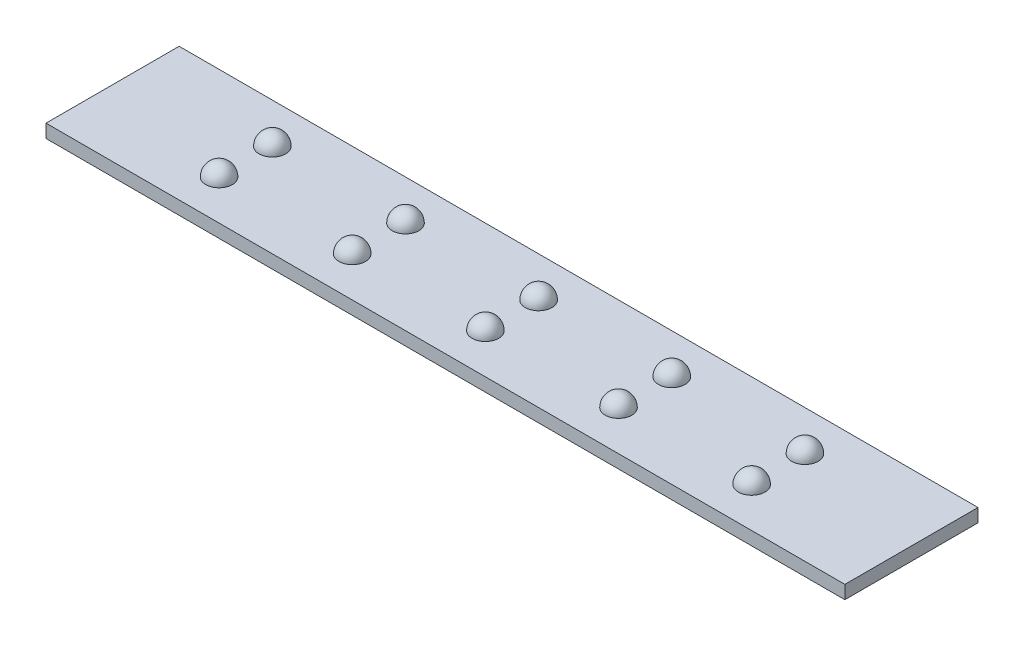
ISO-10303-21;
HEADER;
FILE_DESCRIPTION(('STEP AP214'),'2;1');
FILE_NAME('part.step','',(''),(''),'','','');
FILE_SCHEMA(('AUTOMOTIVE_DESIGN { 1 0 10303 214 1 1 1 1 }'));
ENDSEC;
DATA;
#1=APPLICATION_CONTEXT('core data for automotive mechanical design processes');
#2=APPLICATION_PROTOCOL_DEFINITION('international standard','automotive_design',2000,#1);
#3=PRODUCT_CONTEXT('',#1,'mechanical');
#4=PRODUCT('Part','Part','',(#3));
#5=PRODUCT_RELATED_PRODUCT_CATEGORY('part','',(#4));
#6=PRODUCT_DEFINITION_FORMATION('','',#4);
#7=PRODUCT_DEFINITION_CONTEXT('part definition',#1,'design');
#8=PRODUCT_DEFINITION('design','',#6,#7);
#9=PRODUCT_DEFINITION_SHAPE('','',#8);
#10=(LENGTH_UNIT() NAMED_UNIT(*) SI_UNIT(.MILLI.,.METRE.));
#11=(NAMED_UNIT(*) PLANE_ANGLE_UNIT() SI_UNIT($,.RADIAN.));
#12=(NAMED_UNIT(*) SI_UNIT($,.STERADIAN.) SOLID_ANGLE_UNIT());
#13=UNCERTAINTY_MEASURE_WITH_UNIT(LENGTH_MEASURE(1.E-05),#10,'distance_accuracy_value','');
#14=(GEOMETRIC_REPRESENTATION_CONTEXT(3) GLOBAL_UNCERTAINTY_ASSIGNED_CONTEXT((#13)) GLOBAL_UNIT_ASSIGNED_CONTEXT((#10,
#11,#12)) REPRESENTATION_CONTEXT('',''));
#15=CARTESIAN_POINT('',(0.,0.,0.));
#16=DIRECTION('',(0.,0.,1.));
#17=DIRECTION('',(1.,0.,0.));
#18=AXIS2_PLACEMENT_3D('',#15,#16,#17);
#19=CARTESIAN_POINT('',(30.,1.,4.99999999999999));
#20=DIRECTION('',(-1.,0.,0.));
#21=DIRECTION('',(0.,0.,1.));
#22=AXIS2_PLACEMENT_3D('',#19,#20,#21);
#23=PLANE('',#22);
#24=DIRECTION('',(0.,0.,-1.));
#25=VECTOR('',#24,1.);
#26=CARTESIAN_POINT('',(30.,0.,4.99999999999999));
#27=LINE('',#26,#25);
#28=CARTESIAN_POINT('',(30.,0.,4.99999999999999));
#29=VERTEX_POINT('',#28);
#30=CARTESIAN_POINT('',(30.,0.,-5.));
#31=VERTEX_POINT('',#30);
#32=EDGE_CURVE('E107',#29,#31,#27,.T.);
#33=ORIENTED_EDGE('',*,*,#32,.T.);
#34=DIRECTION('',(0.,-1.,0.));
#35=VECTOR('',#34,1.);
#36=CARTESIAN_POINT('',(30.,1.,-5.));
#37=LINE('',#36,#35);
#38=CARTESIAN_POINT('',(30.,1.,-5.));
#39=VERTEX_POINT('',#38);
#40=EDGE_CURVE('E11',#39,#31,#37,.T.);
#41=ORIENTED_EDGE('',*,*,#40,.F.);
#42=DIRECTION('',(0.,0.,-1.));
#43=VECTOR('',#42,1.);
#44=CARTESIAN_POINT('',(30.,1.,4.99999999999999));
#45=LINE('',#44,#43);
#46=CARTESIAN_POINT('',(30.,1.,4.99999999999999));
#47=VERTEX_POINT('',#46);
#48=EDGE_CURVE('E91',#47,#39,#45,.T.);
#49=ORIENTED_EDGE('',*,*,#48,.F.);
#50=DIRECTION('',(0.,-1.,0.));
#51=VECTOR('',#50,1.);
#52=CARTESIAN_POINT('',(30.,1.,4.99999999999999));
#53=LINE('',#52,#51);
#54=EDGE_CURVE('E103',#47,#29,#53,.T.);
#55=ORIENTED_EDGE('',*,*,#54,.T.);
#56=EDGE_LOOP('',(#33,#41,#49,#55));
#57=FACE_BOUND('',#56,.T.);
#58=ADVANCED_FACE('F39',(#57),#23,.F.);
#59=CARTESIAN_POINT('',(30.,1.,-5.));
#60=DIRECTION('',(0.,0.,1.));
#61=DIRECTION('',(1.,0.,0.));
#62=AXIS2_PLACEMENT_3D('',#59,#60,#61);
#63=PLANE('',#62);
#64=DIRECTION('',(-1.,0.,0.));
#65=VECTOR('',#64,1.);
#66=CARTESIAN_POINT('',(30.,0.,-5.));
#67=LINE('',#66,#65);
#68=CARTESIAN_POINT('',(-30.,0.,-4.99999999999999));
#69=VERTEX_POINT('',#68);
#70=EDGE_CURVE('E96',#31,#69,#67,.T.);
#71=ORIENTED_EDGE('',*,*,#70,.T.);
#72=DIRECTION('',(0.,-1.,0.));
#73=VECTOR('',#72,1.);
#74=CARTESIAN_POINT('',(-30.,1.,-4.99999999999999));
#75=LINE('',#74,#73);
#76=CARTESIAN_POINT('',(-30.,1.,-4.99999999999999));
#77=VERTEX_POINT('',#76);
#78=EDGE_CURVE('E48',#77,#69,#75,.T.);
#79=ORIENTED_EDGE('',*,*,#78,.F.);
#80=DIRECTION('',(-1.,0.,0.));
#81=VECTOR('',#80,1.);
#82=CARTESIAN_POINT('',(30.,1.,-5.));
#83=LINE('',#82,#81);
#84=EDGE_CURVE('E86',#39,#77,#83,.T.);
#85=ORIENTED_EDGE('',*,*,#84,.F.);
#86=ORIENTED_EDGE('',*,*,#40,.T.);
#87=EDGE_LOOP('',(#71,#79,#85,#86));
#88=FACE_BOUND('',#87,.T.);
#89=ADVANCED_FACE('F95',(#88),#63,.F.);
#90=CARTESIAN_POINT('',(-30.,1.,5.));
#91=DIRECTION('',(1.,0.,0.));
#92=DIRECTION('',(0.,0.,-1.));
#93=AXIS2_PLACEMENT_3D('',#90,#91,#92);
#94=PLANE('',#93);
#95=DIRECTION('',(0.,0.,1.));
#96=VECTOR('',#95,1.);
#97=CARTESIAN_POINT('',(-30.,0.,5.));
#98=LINE('',#97,#96);
#99=CARTESIAN_POINT('',(-30.,0.,5.));
#100=VERTEX_POINT('',#99);
#101=EDGE_CURVE('E73',#69,#100,#98,.T.);
#102=ORIENTED_EDGE('',*,*,#101,.T.);
#103=DIRECTION('',(0.,-1.,0.));
#104=VECTOR('',#103,1.);
#105=CARTESIAN_POINT('',(-30.,1.,5.));
#106=LINE('',#105,#104);
#107=CARTESIAN_POINT('',(-30.,1.,5.));
#108=VERTEX_POINT('',#107);
#109=EDGE_CURVE('E98',#108,#100,#106,.T.);
#110=ORIENTED_EDGE('',*,*,#109,.F.);
#111=DIRECTION('',(0.,0.,1.));
#112=VECTOR('',#111,1.);
#113=CARTESIAN_POINT('',(-30.,1.,5.));
#114=LINE('',#113,#112);
#115=EDGE_CURVE('E89',#77,#108,#114,.T.);
#116=ORIENTED_EDGE('',*,*,#115,.F.);
#117=ORIENTED_EDGE('',*,*,#78,.T.);
#118=EDGE_LOOP('',(#102,#110,#116,#117));
#119=FACE_BOUND('',#118,.T.);
#120=ADVANCED_FACE('F99',(#119),#94,.F.);
#121=CARTESIAN_POINT('',(30.,1.,4.99999999999999));
#122=DIRECTION('',(0.,0.,-1.));
#123=DIRECTION('',(-1.,0.,0.));
#124=AXIS2_PLACEMENT_3D('',#121,#122,#123);
#125=PLANE('',#124);
#126=DIRECTION('',(1.,0.,0.));
#127=VECTOR('',#126,1.);
#128=CARTESIAN_POINT('',(30.,0.,4.99999999999999));
#129=LINE('',#128,#127);
#130=EDGE_CURVE('E79',#100,#29,#129,.T.);
#131=ORIENTED_EDGE('',*,*,#130,.T.);
#132=ORIENTED_EDGE('',*,*,#54,.F.);
#133=DIRECTION('',(1.,0.,0.));
#134=VECTOR('',#133,1.);
#135=CARTESIAN_POINT('',(30.,1.,4.99999999999999));
#136=LINE('',#135,#134);
#137=EDGE_CURVE('E56',#108,#47,#136,.T.);
#138=ORIENTED_EDGE('',*,*,#137,.F.);
#139=ORIENTED_EDGE('',*,*,#109,.T.);
#140=EDGE_LOOP('',(#131,#132,#138,#139));
#141=FACE_BOUND('',#140,.T.);
#142=ADVANCED_FACE('F121',(#141),#125,.F.);
#143=CARTESIAN_POINT('',(0.,1.,0.));
#144=DIRECTION('',(0.,1.,0.));
#145=DIRECTION('',(0.,0.,1.));
#146=AXIS2_PLACEMENT_3D('',#143,#144,#145);
#147=PLANE('',#146);
#148=CARTESIAN_POINT('',(20.,1.,-2.));
#149=DIRECTION('',(0.,-1.,0.));
#150=DIRECTION('',(0.,0.,-1.));
#151=AXIS2_PLACEMENT_3D('',#148,#149,#150);
#152=CIRCLE('',#151,1.);
#153=CARTESIAN_POINT('',(20.,0.999999999999993,-3.));
#154=VERTEX_POINT('',#153);
#155=EDGE_CURVE('E163',#154,#154,#152,.T.);
#156=ORIENTED_EDGE('',*,*,#155,.T.);
#157=EDGE_LOOP('',(#156));
#158=FACE_BOUND('',#157,.T.);
#159=CARTESIAN_POINT('',(20.,1.,2.));
#160=DIRECTION('',(0.,-1.,0.));
#161=DIRECTION('',(0.,0.,-1.));
#162=AXIS2_PLACEMENT_3D('',#159,#160,#161);
#163=CIRCLE('',#162,1.);
#164=CARTESIAN_POINT('',(20.,0.999999999999993,1.));
#165=VERTEX_POINT('',#164);
#166=EDGE_CURVE('E159',#165,#165,#163,.T.);
#167=ORIENTED_EDGE('',*,*,#166,.T.);
#168=EDGE_LOOP('',(#167));
#169=FACE_BOUND('',#168,.T.);
#170=CARTESIAN_POINT('',(10.,1.,-2.));
#171=DIRECTION('',(0.,-1.,0.));
#172=DIRECTION('',(0.,0.,-1.));
#173=AXIS2_PLACEMENT_3D('',#170,#171,#172);
#174=CIRCLE('',#173,1.);
#175=CARTESIAN_POINT('',(10.,0.999999999999993,-3.));
#176=VERTEX_POINT('',#175);
#177=EDGE_CURVE('E155',#176,#176,#174,.T.);
#178=ORIENTED_EDGE('',*,*,#177,.T.);
#179=EDGE_LOOP('',(#178));
#180=FACE_BOUND('',#179,.T.);
#181=CARTESIAN_POINT('',(10.,1.,2.));
#182=DIRECTION('',(0.,-1.,0.));
#183=DIRECTION('',(0.,0.,-1.));
#184=AXIS2_PLACEMENT_3D('',#181,#182,#183);
#185=CIRCLE('',#184,1.);
#186=CARTESIAN_POINT('',(10.,0.999999999999993,1.));
#187=VERTEX_POINT('',#186);
#188=EDGE_CURVE('E151',#187,#187,#185,.T.);
#189=ORIENTED_EDGE('',*,*,#188,.T.);
#190=EDGE_LOOP('',(#189));
#191=FACE_BOUND('',#190,.T.);
#192=CARTESIAN_POINT('',(-20.,1.,-2.));
#193=DIRECTION('',(0.,-1.,0.));
#194=DIRECTION('',(0.,0.,-1.));
#195=AXIS2_PLACEMENT_3D('',#192,#193,#194);
#196=CIRCLE('',#195,1.);
#197=CARTESIAN_POINT('',(-20.,0.999999999999993,-3.));
#198=VERTEX_POINT('',#197);
#199=EDGE_CURVE('E147',#198,#198,#196,.T.);
#200=ORIENTED_EDGE('',*,*,#199,.T.);
#201=EDGE_LOOP('',(#200));
#202=FACE_BOUND('',#201,.T.);
#203=CARTESIAN_POINT('',(-20.,1.,2.));
#204=DIRECTION('',(0.,-1.,0.));
#205=DIRECTION('',(0.,0.,-1.));
#206=AXIS2_PLACEMENT_3D('',#203,#204,#205);
#207=CIRCLE('',#206,1.);
#208=CARTESIAN_POINT('',(-20.,0.999999999999993,1.));
#209=VERTEX_POINT('',#208);
#210=EDGE_CURVE('E143',#209,#209,#207,.T.);
#211=ORIENTED_EDGE('',*,*,#210,.T.);
#212=EDGE_LOOP('',(#211));
#213=FACE_BOUND('',#212,.T.);
#214=CARTESIAN_POINT('',(-10.,1.,-2.));
#215=DIRECTION('',(0.,-1.,0.));
#216=DIRECTION('',(0.,0.,-1.));
#217=AXIS2_PLACEMENT_3D('',#214,#215,#216);
#218=CIRCLE('',#217,1.);
#219=CARTESIAN_POINT('',(-10.,0.999999999999993,-3.));
#220=VERTEX_POINT('',#219);
#221=EDGE_CURVE('E139',#220,#220,#218,.T.);
#222=ORIENTED_EDGE('',*,*,#221,.T.);
#223=EDGE_LOOP('',(#222));
#224=FACE_BOUND('',#223,.T.);
#225=CARTESIAN_POINT('',(-10.,1.,2.));
#226=DIRECTION('',(0.,-1.,0.));
#227=DIRECTION('',(0.,0.,-1.));
#228=AXIS2_PLACEMENT_3D('',#225,#226,#227);
#229=CIRCLE('',#228,1.);
#230=CARTESIAN_POINT('',(-10.,0.999999999999993,1.));
#231=VERTEX_POINT('',#230);
#232=EDGE_CURVE('E135',#231,#231,#229,.T.);
#233=ORIENTED_EDGE('',*,*,#232,.T.);
#234=EDGE_LOOP('',(#233));
#235=FACE_BOUND('',#234,.T.);
#236=CARTESIAN_POINT('',(0.,1.,-2.));
#237=DIRECTION('',(0.,-1.,0.));
#238=DIRECTION('',(0.,0.,-1.));
#239=AXIS2_PLACEMENT_3D('',#236,#237,#238);
#240=CIRCLE('',#239,1.);
#241=CARTESIAN_POINT('',(0.,0.999999999999993,-3.));
#242=VERTEX_POINT('',#241);
#243=EDGE_CURVE('E131',#242,#242,#240,.T.);
#244=ORIENTED_EDGE('',*,*,#243,.T.);
#245=EDGE_LOOP('',(#244));
#246=FACE_BOUND('',#245,.T.);
#247=CARTESIAN_POINT('',(0.,1.,2.));
#248=DIRECTION('',(0.,-1.,0.));
#249=DIRECTION('',(0.,0.,-1.));
#250=AXIS2_PLACEMENT_3D('',#247,#248,#249);
#251=CIRCLE('',#250,1.);
#252=CARTESIAN_POINT('',(0.,0.999999999999993,1.));
#253=VERTEX_POINT('',#252);
#254=EDGE_CURVE('E111',#253,#253,#251,.T.);
#255=ORIENTED_EDGE('',*,*,#254,.T.);
#256=EDGE_LOOP('',(#255));
#257=FACE_BOUND('',#256,.T.);
#258=ORIENTED_EDGE('',*,*,#48,.T.);
#259=ORIENTED_EDGE('',*,*,#84,.T.);
#260=ORIENTED_EDGE('',*,*,#115,.T.);
#261=ORIENTED_EDGE('',*,*,#137,.T.);
#262=EDGE_LOOP('',(#258,#259,#260,#261));
#263=FACE_BOUND('',#262,.T.);
#264=ADVANCED_FACE('F87',(#158,#169,#180,#191,#202,#213,#224,#235,#246,#257,#263),#147,.T.);
#265=CARTESIAN_POINT('',(0.,0.,0.));
#266=DIRECTION('',(0.,1.,0.));
#267=DIRECTION('',(0.,0.,1.));
#268=AXIS2_PLACEMENT_3D('',#265,#266,#267);
#269=PLANE('',#268);
#270=ORIENTED_EDGE('',*,*,#32,.F.);
#271=ORIENTED_EDGE('',*,*,#130,.F.);
#272=ORIENTED_EDGE('',*,*,#101,.F.);
#273=ORIENTED_EDGE('',*,*,#70,.F.);
#274=EDGE_LOOP('',(#270,#271,#272,#273));
#275=FACE_BOUND('',#274,.T.);
#276=ADVANCED_FACE('F124',(#275),#269,.F.);
#277=CARTESIAN_POINT('',(0.,1.,2.));
#278=DIRECTION('',(1.,0.,0.));
#279=DIRECTION('',(0.,0.,-1.));
#280=AXIS2_PLACEMENT_3D('',#277,#278,#279);
#281=SPHERICAL_SURFACE('',#280,1.);
#282=CARTESIAN_POINT('',(0.,1.,2.));
#283=DIRECTION('',(0.,-1.,0.));
#284=DIRECTION('',(0.,0.,-1.));
#285=AXIS2_PLACEMENT_3D('',#282,#283,#284);
#286=SPHERICAL_SURFACE('',#285,1.);
#287=ORIENTED_EDGE('',*,*,#254,.F.);
#288=EDGE_LOOP('',(#287));
#289=FACE_BOUND('',#288,.T.);
#290=ADVANCED_FACE('F193',(#289),#286,.T.);
#291=CARTESIAN_POINT('',(0.,1.,-2.));
#292=DIRECTION('',(1.,0.,0.));
#293=DIRECTION('',(0.,0.,-1.));
#294=AXIS2_PLACEMENT_3D('',#291,#292,#293);
#295=SPHERICAL_SURFACE('',#294,1.);
#296=CARTESIAN_POINT('',(0.,1.,-2.));
#297=DIRECTION('',(0.,-1.,0.));
#298=DIRECTION('',(0.,0.,-1.));
#299=AXIS2_PLACEMENT_3D('',#296,#297,#298);
#300=SPHERICAL_SURFACE('',#299,1.);
#301=ORIENTED_EDGE('',*,*,#243,.F.);
#302=EDGE_LOOP('',(#301));
#303=FACE_BOUND('',#302,.T.);
#304=ADVANCED_FACE('F198',(#303),#300,.T.);
#305=CARTESIAN_POINT('',(-10.,1.,2.));
#306=DIRECTION('',(1.,0.,0.));
#307=DIRECTION('',(0.,0.,-1.));
#308=AXIS2_PLACEMENT_3D('',#305,#306,#307);
#309=SPHERICAL_SURFACE('',#308,1.);
#310=CARTESIAN_POINT('',(-10.,1.,2.));
#311=DIRECTION('',(0.,-1.,0.));
#312=DIRECTION('',(0.,0.,-1.));
#313=AXIS2_PLACEMENT_3D('',#310,#311,#312);
#314=SPHERICAL_SURFACE('',#313,1.);
#315=ORIENTED_EDGE('',*,*,#232,.F.);
#316=EDGE_LOOP('',(#315));
#317=FACE_BOUND('',#316,.T.);
#318=ADVANCED_FACE('F202',(#317),#314,.T.);
#319=CARTESIAN_POINT('',(-10.,1.,-2.));
#320=DIRECTION('',(1.,0.,0.));
#321=DIRECTION('',(0.,0.,-1.));
#322=AXIS2_PLACEMENT_3D('',#319,#320,#321);
#323=SPHERICAL_SURFACE('',#322,1.);
#324=CARTESIAN_POINT('',(-10.,1.,-2.));
#325=DIRECTION('',(0.,-1.,0.));
#326=DIRECTION('',(0.,0.,-1.));
#327=AXIS2_PLACEMENT_3D('',#324,#325,#326);
#328=SPHERICAL_SURFACE('',#327,1.);
#329=ORIENTED_EDGE('',*,*,#221,.F.);
#330=EDGE_LOOP('',(#329));
#331=FACE_BOUND('',#330,.T.);
#332=ADVANCED_FACE('F206',(#331),#328,.T.);
#333=CARTESIAN_POINT('',(-20.,1.,2.));
#334=DIRECTION('',(1.,0.,0.));
#335=DIRECTION('',(0.,0.,-1.));
#336=AXIS2_PLACEMENT_3D('',#333,#334,#335);
#337=SPHERICAL_SURFACE('',#336,1.);
#338=CARTESIAN_POINT('',(-20.,1.,2.));
#339=DIRECTION('',(0.,-1.,0.));
#340=DIRECTION('',(0.,0.,-1.));
#341=AXIS2_PLACEMENT_3D('',#338,#339,#340);
#342=SPHERICAL_SURFACE('',#341,1.);
#343=ORIENTED_EDGE('',*,*,#210,.F.);
#344=EDGE_LOOP('',(#343));
#345=FACE_BOUND('',#344,.T.);
#346=ADVANCED_FACE('F210',(#345),#342,.T.);
#347=CARTESIAN_POINT('',(-20.,1.,-2.));
#348=DIRECTION('',(1.,0.,0.));
#349=DIRECTION('',(0.,0.,-1.));
#350=AXIS2_PLACEMENT_3D('',#347,#348,#349);
#351=SPHERICAL_SURFACE('',#350,1.);
#352=CARTESIAN_POINT('',(-20.,1.,-2.));
#353=DIRECTION('',(0.,-1.,0.));
#354=DIRECTION('',(0.,0.,-1.));
#355=AXIS2_PLACEMENT_3D('',#352,#353,#354);
#356=SPHERICAL_SURFACE('',#355,1.);
#357=ORIENTED_EDGE('',*,*,#199,.F.);
#358=EDGE_LOOP('',(#357));
#359=FACE_BOUND('',#358,.T.);
#360=ADVANCED_FACE('F214',(#359),#356,.T.);
#361=CARTESIAN_POINT('',(10.,1.,2.));
#362=DIRECTION('',(1.,0.,0.));
#363=DIRECTION('',(0.,0.,-1.));
#364=AXIS2_PLACEMENT_3D('',#361,#362,#363);
#365=SPHERICAL_SURFACE('',#364,1.);
#366=CARTESIAN_POINT('',(10.,1.,2.));
#367=DIRECTION('',(0.,-1.,0.));
#368=DIRECTION('',(0.,0.,-1.));
#369=AXIS2_PLACEMENT_3D('',#366,#367,#368);
#370=SPHERICAL_SURFACE('',#369,1.);
#371=ORIENTED_EDGE('',*,*,#188,.F.);
#372=EDGE_LOOP('',(#371));
#373=FACE_BOUND('',#372,.T.);
#374=ADVANCED_FACE('F218',(#373),#370,.T.);
#375=CARTESIAN_POINT('',(10.,1.,-2.));
#376=DIRECTION('',(1.,0.,0.));
#377=DIRECTION('',(0.,0.,-1.));
#378=AXIS2_PLACEMENT_3D('',#375,#376,#377);
#379=SPHERICAL_SURFACE('',#378,1.);
#380=CARTESIAN_POINT('',(10.,1.,-2.));
#381=DIRECTION('',(0.,-1.,0.));
#382=DIRECTION('',(0.,0.,-1.));
#383=AXIS2_PLACEMENT_3D('',#380,#381,#382);
#384=SPHERICAL_SURFACE('',#383,1.);
#385=ORIENTED_EDGE('',*,*,#177,.F.);
#386=EDGE_LOOP('',(#385));
#387=FACE_BOUND('',#386,.T.);
#388=ADVANCED_FACE('F177',(#387),#384,.T.);
#389=CARTESIAN_POINT('',(20.,1.,2.));
#390=DIRECTION('',(1.,0.,0.));
#391=DIRECTION('',(0.,0.,-1.));
#392=AXIS2_PLACEMENT_3D('',#389,#390,#391);
#393=SPHERICAL_SURFACE('',#392,1.);
#394=CARTESIAN_POINT('',(20.,1.,2.));
#395=DIRECTION('',(0.,-1.,0.));
#396=DIRECTION('',(0.,0.,-1.));
#397=AXIS2_PLACEMENT_3D('',#394,#395,#396);
#398=SPHERICAL_SURFACE('',#397,1.);
#399=ORIENTED_EDGE('',*,*,#166,.F.);
#400=EDGE_LOOP('',(#399));
#401=FACE_BOUND('',#400,.T.);
#402=ADVANCED_FACE('F172',(#401),#398,.T.);
#403=CARTESIAN_POINT('',(20.,1.,-2.));
#404=DIRECTION('',(1.,0.,0.));
#405=DIRECTION('',(0.,0.,-1.));
#406=AXIS2_PLACEMENT_3D('',#403,#404,#405);
#407=SPHERICAL_SURFACE('',#406,1.);
#408=CARTESIAN_POINT('',(20.,1.,-2.));
#409=DIRECTION('',(0.,-1.,0.));
#410=DIRECTION('',(0.,0.,-1.));
#411=AXIS2_PLACEMENT_3D('',#408,#409,#410);
#412=SPHERICAL_SURFACE('',#411,1.);
#413=ORIENTED_EDGE('',*,*,#155,.F.);
#414=EDGE_LOOP('',(#413));
#415=FACE_BOUND('',#414,.T.);
#416=ADVANCED_FACE('F170',(#415),#412,.T.);
#417=CLOSED_SHELL('',(#58,#89,#120,#142,#264,#276,#290,#304,#318,#332,#346,#360,#374,#388,#402,#416));
#418=MANIFOLD_SOLID_BREP('B2',#417);
#419=ADVANCED_BREP_SHAPE_REPRESENTATION('',(#18,#418),#14);
#420=SHAPE_DEFINITION_REPRESENTATION(#9,#419);
ENDSEC;
END-ISO-10303-21;
